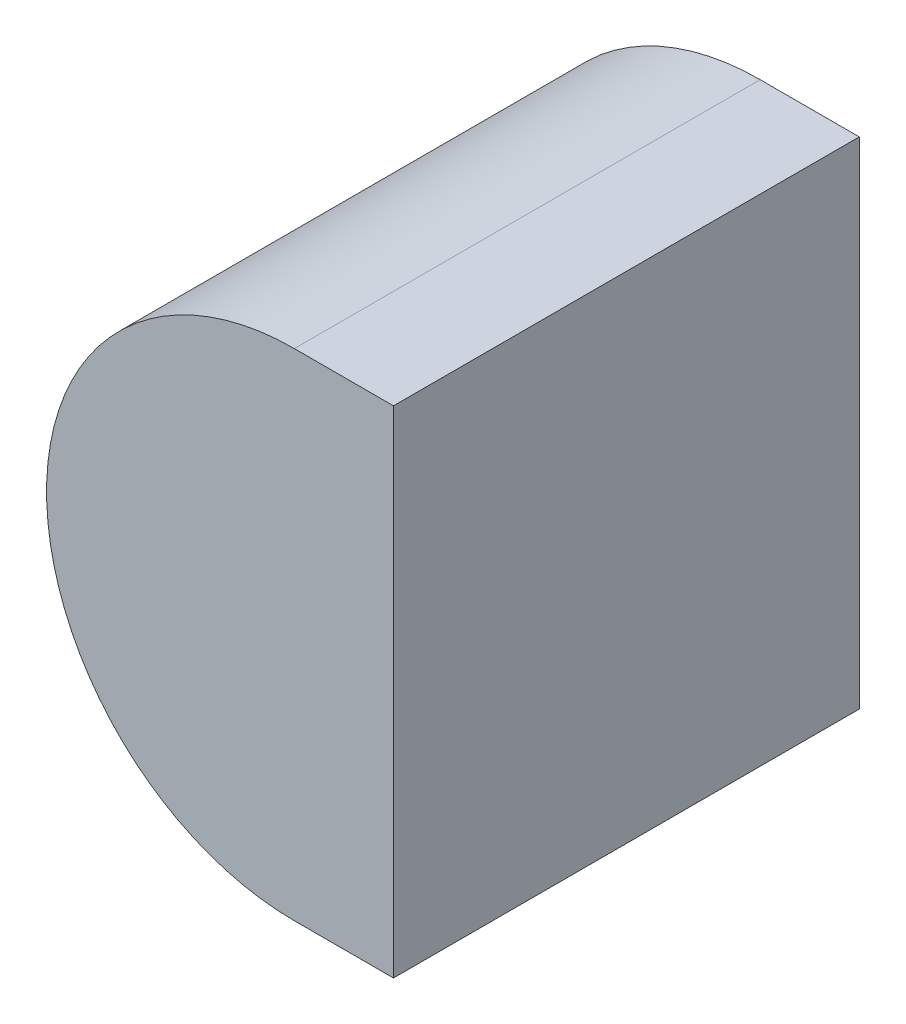
ISO-10303-21;
HEADER;
FILE_DESCRIPTION(('STEP AP214'),'2;1');
FILE_NAME('part.step','',(''),(''),'','','');
FILE_SCHEMA(('AUTOMOTIVE_DESIGN { 1 0 10303 214 1 1 1 1 }'));
ENDSEC;
DATA;
#1=APPLICATION_CONTEXT('core data for automotive mechanical design processes');
#2=APPLICATION_PROTOCOL_DEFINITION('international standard','automotive_design',2000,#1);
#3=PRODUCT_CONTEXT('',#1,'mechanical');
#4=PRODUCT('Part','Part','',(#3));
#5=PRODUCT_RELATED_PRODUCT_CATEGORY('part','',(#4));
#6=PRODUCT_DEFINITION_FORMATION('','',#4);
#7=PRODUCT_DEFINITION_CONTEXT('part definition',#1,'design');
#8=PRODUCT_DEFINITION('design','',#6,#7);
#9=PRODUCT_DEFINITION_SHAPE('','',#8);
#10=(LENGTH_UNIT() NAMED_UNIT(*) SI_UNIT(.MILLI.,.METRE.));
#11=(NAMED_UNIT(*) PLANE_ANGLE_UNIT() SI_UNIT($,.RADIAN.));
#12=(NAMED_UNIT(*) SI_UNIT($,.STERADIAN.) SOLID_ANGLE_UNIT());
#13=UNCERTAINTY_MEASURE_WITH_UNIT(LENGTH_MEASURE(1.E-05),#10,'distance_accuracy_value','');
#14=(GEOMETRIC_REPRESENTATION_CONTEXT(3) GLOBAL_UNCERTAINTY_ASSIGNED_CONTEXT((#13)) GLOBAL_UNIT_ASSIGNED_CONTEXT((#10,
#11,#12)) REPRESENTATION_CONTEXT('',''));
#15=CARTESIAN_POINT('',(0.,0.,0.));
#16=DIRECTION('',(0.,0.,1.));
#17=DIRECTION('',(1.,0.,0.));
#18=AXIS2_PLACEMENT_3D('',#15,#16,#17);
#19=CARTESIAN_POINT('',(457.46165642121,4.70131085897416,4.7));
#20=DIRECTION('',(0.,0.,-1.));
#21=DIRECTION('',(-1.,0.,0.));
#22=AXIS2_PLACEMENT_3D('',#19,#20,#21);
#23=CYLINDRICAL_SURFACE('',#22,2.5);
#24=CARTESIAN_POINT('',(457.46165642121,4.70131085897416,0.));
#25=DIRECTION('',(0.,0.,1.));
#26=DIRECTION('',(1.,0.,0.));
#27=AXIS2_PLACEMENT_3D('',#24,#25,#26);
#28=CIRCLE('',#27,2.5);
#29=CARTESIAN_POINT('',(457.46165642121,7.20131085897416,0.));
#30=VERTEX_POINT('',#29);
#31=CARTESIAN_POINT('',(457.46165642121,2.20131085897416,0.));
#32=VERTEX_POINT('',#31);
#33=EDGE_CURVE('E96',#30,#32,#28,.T.);
#34=ORIENTED_EDGE('',*,*,#33,.T.);
#35=DIRECTION('',(0.,0.,-1.));
#36=VECTOR('',#35,1.);
#37=CARTESIAN_POINT('',(457.46165642121,2.20131085897416,4.7));
#38=LINE('',#37,#36);
#39=CARTESIAN_POINT('',(457.46165642121,2.20131085897416,4.7));
#40=VERTEX_POINT('',#39);
#41=EDGE_CURVE('E11',#40,#32,#38,.T.);
#42=ORIENTED_EDGE('',*,*,#41,.F.);
#43=CARTESIAN_POINT('',(457.46165642121,4.70131085897416,4.7));
#44=DIRECTION('',(0.,0.,1.));
#45=DIRECTION('',(1.,0.,0.));
#46=AXIS2_PLACEMENT_3D('',#43,#44,#45);
#47=CIRCLE('',#46,2.5);
#48=CARTESIAN_POINT('',(457.46165642121,7.20131085897416,4.7));
#49=VERTEX_POINT('',#48);
#50=EDGE_CURVE('E84',#49,#40,#47,.T.);
#51=ORIENTED_EDGE('',*,*,#50,.F.);
#52=DIRECTION('',(0.,0.,-1.));
#53=VECTOR('',#52,1.);
#54=CARTESIAN_POINT('',(457.46165642121,7.20131085897416,4.7));
#55=LINE('',#54,#53);
#56=EDGE_CURVE('E92',#49,#30,#55,.T.);
#57=ORIENTED_EDGE('',*,*,#56,.T.);
#58=EDGE_LOOP('',(#34,#42,#51,#57));
#59=FACE_BOUND('',#58,.T.);
#60=ADVANCED_FACE('F33',(#59),#23,.T.);
#61=CARTESIAN_POINT('',(458.46165642121,2.20131085897416,4.7));
#62=DIRECTION('',(0.,1.,0.));
#63=DIRECTION('',(0.,0.,1.));
#64=AXIS2_PLACEMENT_3D('',#61,#62,#63);
#65=PLANE('',#64);
#66=DIRECTION('',(1.,0.,0.));
#67=VECTOR('',#66,1.);
#68=CARTESIAN_POINT('',(458.46165642121,2.20131085897416,0.));
#69=LINE('',#68,#67);
#70=CARTESIAN_POINT('',(458.46165642121,2.20131085897416,0.));
#71=VERTEX_POINT('',#70);
#72=EDGE_CURVE('E88',#32,#71,#69,.T.);
#73=ORIENTED_EDGE('',*,*,#72,.T.);
#74=DIRECTION('',(0.,0.,-1.));
#75=VECTOR('',#74,1.);
#76=CARTESIAN_POINT('',(458.46165642121,2.20131085897416,4.7));
#77=LINE('',#76,#75);
#78=CARTESIAN_POINT('',(458.46165642121,2.20131085897416,4.7));
#79=VERTEX_POINT('',#78);
#80=EDGE_CURVE('E41',#79,#71,#77,.T.);
#81=ORIENTED_EDGE('',*,*,#80,.F.);
#82=DIRECTION('',(1.,0.,0.));
#83=VECTOR('',#82,1.);
#84=CARTESIAN_POINT('',(458.46165642121,2.20131085897416,4.7));
#85=LINE('',#84,#83);
#86=EDGE_CURVE('E79',#40,#79,#85,.T.);
#87=ORIENTED_EDGE('',*,*,#86,.F.);
#88=ORIENTED_EDGE('',*,*,#41,.T.);
#89=EDGE_LOOP('',(#73,#81,#87,#88));
#90=FACE_BOUND('',#89,.T.);
#91=ADVANCED_FACE('F87',(#90),#65,.F.);
#92=CARTESIAN_POINT('',(458.46165642121,7.20131085897416,4.7));
#93=DIRECTION('',(-1.,0.,0.));
#94=DIRECTION('',(0.,0.,1.));
#95=AXIS2_PLACEMENT_3D('',#92,#93,#94);
#96=PLANE('',#95);
#97=DIRECTION('',(0.,1.,0.));
#98=VECTOR('',#97,1.);
#99=CARTESIAN_POINT('',(458.46165642121,7.20131085897416,0.));
#100=LINE('',#99,#98);
#101=CARTESIAN_POINT('',(458.46165642121,7.20131085897416,0.));
#102=VERTEX_POINT('',#101);
#103=EDGE_CURVE('E66',#71,#102,#100,.T.);
#104=ORIENTED_EDGE('',*,*,#103,.T.);
#105=DIRECTION('',(0.,0.,-1.));
#106=VECTOR('',#105,1.);
#107=CARTESIAN_POINT('',(458.46165642121,7.20131085897416,4.7));
#108=LINE('',#107,#106);
#109=CARTESIAN_POINT('',(458.46165642121,7.20131085897416,4.7));
#110=VERTEX_POINT('',#109);
#111=EDGE_CURVE('E89',#110,#102,#108,.T.);
#112=ORIENTED_EDGE('',*,*,#111,.F.);
#113=DIRECTION('',(0.,1.,0.));
#114=VECTOR('',#113,1.);
#115=CARTESIAN_POINT('',(458.46165642121,7.20131085897416,4.7));
#116=LINE('',#115,#114);
#117=EDGE_CURVE('E82',#79,#110,#116,.T.);
#118=ORIENTED_EDGE('',*,*,#117,.F.);
#119=ORIENTED_EDGE('',*,*,#80,.T.);
#120=EDGE_LOOP('',(#104,#112,#118,#119));
#121=FACE_BOUND('',#120,.T.);
#122=ADVANCED_FACE('F90',(#121),#96,.F.);
#123=CARTESIAN_POINT('',(458.46165642121,7.20131085897416,4.7));
#124=DIRECTION('',(0.,-1.,0.));
#125=DIRECTION('',(0.,0.,-1.));
#126=AXIS2_PLACEMENT_3D('',#123,#124,#125);
#127=PLANE('',#126);
#128=DIRECTION('',(-1.,0.,0.));
#129=VECTOR('',#128,1.);
#130=CARTESIAN_POINT('',(458.46165642121,7.20131085897416,0.));
#131=LINE('',#130,#129);
#132=EDGE_CURVE('E72',#102,#30,#131,.T.);
#133=ORIENTED_EDGE('',*,*,#132,.T.);
#134=ORIENTED_EDGE('',*,*,#56,.F.);
#135=DIRECTION('',(-1.,0.,0.));
#136=VECTOR('',#135,1.);
#137=CARTESIAN_POINT('',(458.46165642121,7.20131085897416,4.7));
#138=LINE('',#137,#136);
#139=EDGE_CURVE('E49',#110,#49,#138,.T.);
#140=ORIENTED_EDGE('',*,*,#139,.F.);
#141=ORIENTED_EDGE('',*,*,#111,.T.);
#142=EDGE_LOOP('',(#133,#134,#140,#141));
#143=FACE_BOUND('',#142,.T.);
#144=ADVANCED_FACE('F103',(#143),#127,.F.);
#145=CARTESIAN_POINT('',(457.46165642121,4.70131085897416,4.7));
#146=DIRECTION('',(0.,0.,1.));
#147=DIRECTION('',(1.,0.,0.));
#148=AXIS2_PLACEMENT_3D('',#145,#146,#147);
#149=PLANE('',#148);
#150=ORIENTED_EDGE('',*,*,#50,.T.);
#151=ORIENTED_EDGE('',*,*,#86,.T.);
#152=ORIENTED_EDGE('',*,*,#117,.T.);
#153=ORIENTED_EDGE('',*,*,#139,.T.);
#154=EDGE_LOOP('',(#150,#151,#152,#153));
#155=FACE_BOUND('',#154,.T.);
#156=ADVANCED_FACE('F80',(#155),#149,.T.);
#157=CARTESIAN_POINT('',(457.46165642121,4.70131085897416,0.));
#158=DIRECTION('',(0.,0.,1.));
#159=DIRECTION('',(1.,0.,0.));
#160=AXIS2_PLACEMENT_3D('',#157,#158,#159);
#161=PLANE('',#160);
#162=ORIENTED_EDGE('',*,*,#33,.F.);
#163=ORIENTED_EDGE('',*,*,#132,.F.);
#164=ORIENTED_EDGE('',*,*,#103,.F.);
#165=ORIENTED_EDGE('',*,*,#72,.F.);
#166=EDGE_LOOP('',(#162,#163,#164,#165));
#167=FACE_BOUND('',#166,.T.);
#168=ADVANCED_FACE('F106',(#167),#161,.F.);
#169=CLOSED_SHELL('',(#60,#91,#122,#144,#156,#168));
#170=MANIFOLD_SOLID_BREP('B2',#169);
#171=ADVANCED_BREP_SHAPE_REPRESENTATION('',(#18,#170),#14);
#172=SHAPE_DEFINITION_REPRESENTATION(#9,#171);
ENDSEC;
END-ISO-10303-21;
